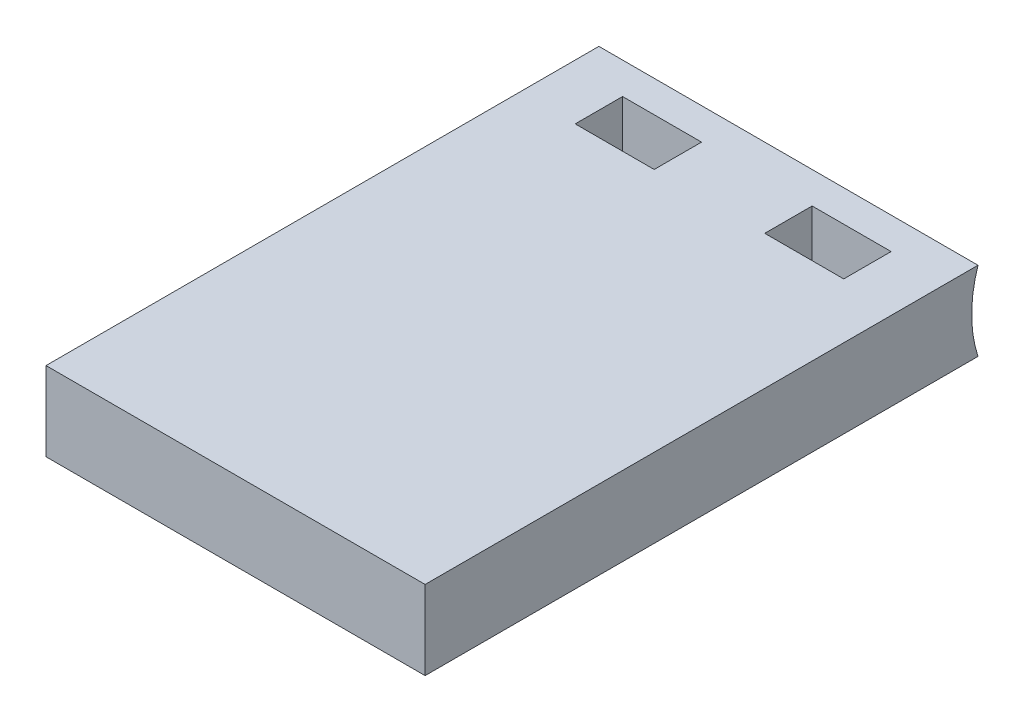
ISO-10303-21;
HEADER;
FILE_DESCRIPTION(('STEP AP214'),'2;1');
FILE_NAME('part.step','',(''),(''),'','','');
FILE_SCHEMA(('AUTOMOTIVE_DESIGN { 1 0 10303 214 1 1 1 1 }'));
ENDSEC;
DATA;
#1=APPLICATION_CONTEXT('core data for automotive mechanical design processes');
#2=APPLICATION_PROTOCOL_DEFINITION('international standard','automotive_design',2000,#1);
#3=PRODUCT_CONTEXT('',#1,'mechanical');
#4=PRODUCT('Part','Part','',(#3));
#5=PRODUCT_RELATED_PRODUCT_CATEGORY('part','',(#4));
#6=PRODUCT_DEFINITION_FORMATION('','',#4);
#7=PRODUCT_DEFINITION_CONTEXT('part definition',#1,'design');
#8=PRODUCT_DEFINITION('design','',#6,#7);
#9=PRODUCT_DEFINITION_SHAPE('','',#8);
#10=(LENGTH_UNIT() NAMED_UNIT(*) SI_UNIT(.MILLI.,.METRE.));
#11=(NAMED_UNIT(*) PLANE_ANGLE_UNIT() SI_UNIT($,.RADIAN.));
#12=(NAMED_UNIT(*) SI_UNIT($,.STERADIAN.) SOLID_ANGLE_UNIT());
#13=UNCERTAINTY_MEASURE_WITH_UNIT(LENGTH_MEASURE(1.E-05),#10,'distance_accuracy_value','');
#14=(GEOMETRIC_REPRESENTATION_CONTEXT(3) GLOBAL_UNCERTAINTY_ASSIGNED_CONTEXT((#13)) GLOBAL_UNIT_ASSIGNED_CONTEXT((#10,
#11,#12)) REPRESENTATION_CONTEXT('',''));
#15=CARTESIAN_POINT('',(0.,0.,0.));
#16=DIRECTION('',(0.,0.,1.));
#17=DIRECTION('',(1.,0.,0.));
#18=AXIS2_PLACEMENT_3D('',#15,#16,#17);
#19=CARTESIAN_POINT('',(-12.,5.,17.5));
#20=DIRECTION('',(1.,0.,0.));
#21=DIRECTION('',(0.,0.,-1.));
#22=AXIS2_PLACEMENT_3D('',#19,#20,#21);
#23=PLANE('',#22);
#24=DIRECTION('',(0.,0.,1.));
#25=VECTOR('',#24,1.);
#26=CARTESIAN_POINT('',(-12.,5.,17.5));
#27=LINE('',#26,#25);
#28=CARTESIAN_POINT('',(-12.,5.,-17.5));
#29=VERTEX_POINT('',#28);
#30=CARTESIAN_POINT('',(-12.,5.,17.5));
#31=VERTEX_POINT('',#30);
#32=EDGE_CURVE('E197',#29,#31,#27,.T.);
#33=ORIENTED_EDGE('',*,*,#32,.F.);
#34=CARTESIAN_POINT('',(-12.,2.5,-25.0993420767853));
#35=DIRECTION('',(-1.,0.,0.));
#36=DIRECTION('',(0.,0.,1.));
#37=AXIS2_PLACEMENT_3D('',#34,#35,#36);
#38=CIRCLE('',#37,8.);
#39=CARTESIAN_POINT('',(-12.,0.,-17.5));
#40=VERTEX_POINT('',#39);
#41=EDGE_CURVE('E159',#40,#29,#38,.T.);
#42=ORIENTED_EDGE('',*,*,#41,.F.);
#43=DIRECTION('',(0.,0.,1.));
#44=VECTOR('',#43,1.);
#45=CARTESIAN_POINT('',(-12.,0.,17.5));
#46=LINE('',#45,#44);
#47=CARTESIAN_POINT('',(-12.,0.,17.5));
#48=VERTEX_POINT('',#47);
#49=EDGE_CURVE('E195',#40,#48,#46,.T.);
#50=ORIENTED_EDGE('',*,*,#49,.T.);
#51=DIRECTION('',(0.,-1.,0.));
#52=VECTOR('',#51,1.);
#53=CARTESIAN_POINT('',(-12.,5.,17.5));
#54=LINE('',#53,#52);
#55=EDGE_CURVE('E11',#31,#48,#54,.T.);
#56=ORIENTED_EDGE('',*,*,#55,.F.);
#57=EDGE_LOOP('',(#33,#42,#50,#56));
#58=FACE_BOUND('',#57,.T.);
#59=ADVANCED_FACE('F34',(#58),#23,.F.);
#60=CARTESIAN_POINT('',(12.,5.,17.5));
#61=DIRECTION('',(0.,0.,-1.));
#62=DIRECTION('',(-1.,0.,0.));
#63=AXIS2_PLACEMENT_3D('',#60,#61,#62);
#64=PLANE('',#63);
#65=DIRECTION('',(1.,0.,0.));
#66=VECTOR('',#65,1.);
#67=CARTESIAN_POINT('',(12.,0.,17.5));
#68=LINE('',#67,#66);
#69=CARTESIAN_POINT('',(12.,0.,17.5));
#70=VERTEX_POINT('',#69);
#71=EDGE_CURVE('E211',#48,#70,#68,.T.);
#72=ORIENTED_EDGE('',*,*,#71,.T.);
#73=DIRECTION('',(0.,-1.,0.));
#74=VECTOR('',#73,1.);
#75=CARTESIAN_POINT('',(12.,5.,17.5));
#76=LINE('',#75,#74);
#77=CARTESIAN_POINT('',(12.,5.,17.5));
#78=VERTEX_POINT('',#77);
#79=EDGE_CURVE('E41',#78,#70,#76,.T.);
#80=ORIENTED_EDGE('',*,*,#79,.F.);
#81=DIRECTION('',(1.,0.,0.));
#82=VECTOR('',#81,1.);
#83=CARTESIAN_POINT('',(12.,5.,17.5));
#84=LINE('',#83,#82);
#85=EDGE_CURVE('E200',#31,#78,#84,.T.);
#86=ORIENTED_EDGE('',*,*,#85,.F.);
#87=ORIENTED_EDGE('',*,*,#55,.T.);
#88=EDGE_LOOP('',(#72,#80,#86,#87));
#89=FACE_BOUND('',#88,.T.);
#90=ADVANCED_FACE('F234',(#89),#64,.F.);
#91=CARTESIAN_POINT('',(12.,5.,17.5));
#92=DIRECTION('',(-1.,0.,0.));
#93=DIRECTION('',(0.,0.,1.));
#94=AXIS2_PLACEMENT_3D('',#91,#92,#93);
#95=PLANE('',#94);
#96=DIRECTION('',(0.,0.,-1.));
#97=VECTOR('',#96,1.);
#98=CARTESIAN_POINT('',(12.,0.,17.5));
#99=LINE('',#98,#97);
#100=CARTESIAN_POINT('',(12.,0.,-17.5));
#101=VERTEX_POINT('',#100);
#102=EDGE_CURVE('E213',#70,#101,#99,.T.);
#103=ORIENTED_EDGE('',*,*,#102,.T.);
#104=CARTESIAN_POINT('',(12.,2.5,-25.0993420767853));
#105=DIRECTION('',(-1.,0.,0.));
#106=DIRECTION('',(0.,0.,1.));
#107=AXIS2_PLACEMENT_3D('',#104,#105,#106);
#108=CIRCLE('',#107,8.);
#109=CARTESIAN_POINT('',(12.,5.,-17.5));
#110=VERTEX_POINT('',#109);
#111=EDGE_CURVE('E192',#101,#110,#108,.T.);
#112=ORIENTED_EDGE('',*,*,#111,.T.);
#113=DIRECTION('',(0.,0.,-1.));
#114=VECTOR('',#113,1.);
#115=CARTESIAN_POINT('',(12.,5.,17.5));
#116=LINE('',#115,#114);
#117=EDGE_CURVE('E203',#78,#110,#116,.T.);
#118=ORIENTED_EDGE('',*,*,#117,.F.);
#119=ORIENTED_EDGE('',*,*,#79,.T.);
#120=EDGE_LOOP('',(#103,#112,#118,#119));
#121=FACE_BOUND('',#120,.T.);
#122=ADVANCED_FACE('F221',(#121),#95,.F.);
#123=CARTESIAN_POINT('',(0.,5.,0.));
#124=DIRECTION('',(0.,1.,0.));
#125=DIRECTION('',(0.,0.,1.));
#126=AXIS2_PLACEMENT_3D('',#123,#124,#125);
#127=PLANE('',#126);
#128=DIRECTION('',(0.,0.,1.));
#129=VECTOR('',#128,1.);
#130=CARTESIAN_POINT('',(-8.5,5.,-12.5));
#131=LINE('',#130,#129);
#132=CARTESIAN_POINT('',(-8.5,5.,-15.5));
#133=VERTEX_POINT('',#132);
#134=CARTESIAN_POINT('',(-8.5,5.,-12.5));
#135=VERTEX_POINT('',#134);
#136=EDGE_CURVE('E48',#133,#135,#131,.T.);
#137=ORIENTED_EDGE('',*,*,#136,.F.);
#138=DIRECTION('',(-1.,0.,0.));
#139=VECTOR('',#138,1.);
#140=CARTESIAN_POINT('',(-3.5,5.,-15.5));
#141=LINE('',#140,#139);
#142=CARTESIAN_POINT('',(-3.5,5.,-15.5));
#143=VERTEX_POINT('',#142);
#144=EDGE_CURVE('E143',#143,#133,#141,.T.);
#145=ORIENTED_EDGE('',*,*,#144,.F.);
#146=DIRECTION('',(0.,0.,-1.));
#147=VECTOR('',#146,1.);
#148=CARTESIAN_POINT('',(-3.5,5.,-12.5));
#149=LINE('',#148,#147);
#150=CARTESIAN_POINT('',(-3.5,5.,-12.5));
#151=VERTEX_POINT('',#150);
#152=EDGE_CURVE('E146',#151,#143,#149,.T.);
#153=ORIENTED_EDGE('',*,*,#152,.F.);
#154=DIRECTION('',(1.,0.,0.));
#155=VECTOR('',#154,1.);
#156=CARTESIAN_POINT('',(-3.5,5.,-12.5));
#157=LINE('',#156,#155);
#158=EDGE_CURVE('E152',#135,#151,#157,.T.);
#159=ORIENTED_EDGE('',*,*,#158,.F.);
#160=EDGE_LOOP('',(#137,#145,#153,#159));
#161=FACE_BOUND('',#160,.T.);
#162=DIRECTION('',(0.,0.,1.));
#163=VECTOR('',#162,1.);
#164=CARTESIAN_POINT('',(3.5,5.,-12.5));
#165=LINE('',#164,#163);
#166=CARTESIAN_POINT('',(3.5,5.,-15.5));
#167=VERTEX_POINT('',#166);
#168=CARTESIAN_POINT('',(3.5,5.,-12.5));
#169=VERTEX_POINT('',#168);
#170=EDGE_CURVE('E56',#167,#169,#165,.T.);
#171=ORIENTED_EDGE('',*,*,#170,.F.);
#172=DIRECTION('',(-1.,0.,0.));
#173=VECTOR('',#172,1.);
#174=CARTESIAN_POINT('',(8.5,5.,-15.5));
#175=LINE('',#174,#173);
#176=CARTESIAN_POINT('',(8.5,5.,-15.5));
#177=VERTEX_POINT('',#176);
#178=EDGE_CURVE('E167',#177,#167,#175,.T.);
#179=ORIENTED_EDGE('',*,*,#178,.F.);
#180=DIRECTION('',(0.,0.,-1.));
#181=VECTOR('',#180,1.);
#182=CARTESIAN_POINT('',(8.5,5.,-12.5));
#183=LINE('',#182,#181);
#184=CARTESIAN_POINT('',(8.5,5.,-12.5));
#185=VERTEX_POINT('',#184);
#186=EDGE_CURVE('E181',#185,#177,#183,.T.);
#187=ORIENTED_EDGE('',*,*,#186,.F.);
#188=DIRECTION('',(1.,0.,0.));
#189=VECTOR('',#188,1.);
#190=CARTESIAN_POINT('',(8.5,5.,-12.5));
#191=LINE('',#190,#189);
#192=EDGE_CURVE('E178',#169,#185,#191,.T.);
#193=ORIENTED_EDGE('',*,*,#192,.F.);
#194=EDGE_LOOP('',(#171,#179,#187,#193));
#195=FACE_BOUND('',#194,.T.);
#196=ORIENTED_EDGE('',*,*,#32,.T.);
#197=ORIENTED_EDGE('',*,*,#85,.T.);
#198=ORIENTED_EDGE('',*,*,#117,.T.);
#199=DIRECTION('',(-1.,0.,0.));
#200=VECTOR('',#199,1.);
#201=CARTESIAN_POINT('',(12.,5.,-17.5));
#202=LINE('',#201,#200);
#203=EDGE_CURVE('E206',#110,#29,#202,.T.);
#204=ORIENTED_EDGE('',*,*,#203,.T.);
#205=EDGE_LOOP('',(#196,#197,#198,#204));
#206=FACE_BOUND('',#205,.T.);
#207=ADVANCED_FACE('F233',(#161,#195,#206),#127,.T.);
#208=CARTESIAN_POINT('',(0.,0.,0.));
#209=DIRECTION('',(0.,1.,0.));
#210=DIRECTION('',(0.,0.,1.));
#211=AXIS2_PLACEMENT_3D('',#208,#209,#210);
#212=PLANE('',#211);
#213=DIRECTION('',(-1.,0.,0.));
#214=VECTOR('',#213,1.);
#215=CARTESIAN_POINT('',(-3.5,0.,-15.5));
#216=LINE('',#215,#214);
#217=CARTESIAN_POINT('',(-3.5,0.,-15.5));
#218=VERTEX_POINT('',#217);
#219=CARTESIAN_POINT('',(-8.5,0.,-15.5));
#220=VERTEX_POINT('',#219);
#221=EDGE_CURVE('E130',#218,#220,#216,.T.);
#222=ORIENTED_EDGE('',*,*,#221,.T.);
#223=DIRECTION('',(0.,0.,1.));
#224=VECTOR('',#223,1.);
#225=CARTESIAN_POINT('',(-8.5,0.,-12.5));
#226=LINE('',#225,#224);
#227=CARTESIAN_POINT('',(-8.5,0.,-12.5));
#228=VERTEX_POINT('',#227);
#229=EDGE_CURVE('E124',#220,#228,#226,.T.);
#230=ORIENTED_EDGE('',*,*,#229,.T.);
#231=DIRECTION('',(1.,0.,0.));
#232=VECTOR('',#231,1.);
#233=CARTESIAN_POINT('',(-3.5,0.,-12.5));
#234=LINE('',#233,#232);
#235=CARTESIAN_POINT('',(-3.5,0.,-12.5));
#236=VERTEX_POINT('',#235);
#237=EDGE_CURVE('E134',#228,#236,#234,.T.);
#238=ORIENTED_EDGE('',*,*,#237,.T.);
#239=DIRECTION('',(0.,0.,-1.));
#240=VECTOR('',#239,1.);
#241=CARTESIAN_POINT('',(-3.5,0.,-12.5));
#242=LINE('',#241,#240);
#243=EDGE_CURVE('E138',#236,#218,#242,.T.);
#244=ORIENTED_EDGE('',*,*,#243,.T.);
#245=EDGE_LOOP('',(#222,#230,#238,#244));
#246=FACE_BOUND('',#245,.T.);
#247=DIRECTION('',(-1.,0.,0.));
#248=VECTOR('',#247,1.);
#249=CARTESIAN_POINT('',(8.5,0.,-15.5));
#250=LINE('',#249,#248);
#251=CARTESIAN_POINT('',(8.5,0.,-15.5));
#252=VERTEX_POINT('',#251);
#253=CARTESIAN_POINT('',(3.5,0.,-15.5));
#254=VERTEX_POINT('',#253);
#255=EDGE_CURVE('E173',#252,#254,#250,.T.);
#256=ORIENTED_EDGE('',*,*,#255,.T.);
#257=DIRECTION('',(0.,0.,1.));
#258=VECTOR('',#257,1.);
#259=CARTESIAN_POINT('',(3.5,0.,-12.5));
#260=LINE('',#259,#258);
#261=CARTESIAN_POINT('',(3.5,0.,-12.5));
#262=VERTEX_POINT('',#261);
#263=EDGE_CURVE('E163',#254,#262,#260,.T.);
#264=ORIENTED_EDGE('',*,*,#263,.T.);
#265=DIRECTION('',(1.,0.,0.));
#266=VECTOR('',#265,1.);
#267=CARTESIAN_POINT('',(8.5,0.,-12.5));
#268=LINE('',#267,#266);
#269=CARTESIAN_POINT('',(8.5,0.,-12.5));
#270=VERTEX_POINT('',#269);
#271=EDGE_CURVE('E166',#262,#270,#268,.T.);
#272=ORIENTED_EDGE('',*,*,#271,.T.);
#273=DIRECTION('',(0.,0.,-1.));
#274=VECTOR('',#273,1.);
#275=CARTESIAN_POINT('',(8.5,0.,-12.5));
#276=LINE('',#275,#274);
#277=EDGE_CURVE('E170',#270,#252,#276,.T.);
#278=ORIENTED_EDGE('',*,*,#277,.T.);
#279=EDGE_LOOP('',(#256,#264,#272,#278));
#280=FACE_BOUND('',#279,.T.);
#281=ORIENTED_EDGE('',*,*,#49,.F.);
#282=DIRECTION('',(-1.,0.,0.));
#283=VECTOR('',#282,1.);
#284=CARTESIAN_POINT('',(12.,0.,-17.5));
#285=LINE('',#284,#283);
#286=EDGE_CURVE('E201',#101,#40,#285,.T.);
#287=ORIENTED_EDGE('',*,*,#286,.F.);
#288=ORIENTED_EDGE('',*,*,#102,.F.);
#289=ORIENTED_EDGE('',*,*,#71,.F.);
#290=EDGE_LOOP('',(#281,#287,#288,#289));
#291=FACE_BOUND('',#290,.T.);
#292=ADVANCED_FACE('F140',(#246,#280,#291),#212,.F.);
#293=CARTESIAN_POINT('',(12.,2.5,-25.0993420767853));
#294=DIRECTION('',(-1.,0.,0.));
#295=DIRECTION('',(0.,0.,1.));
#296=AXIS2_PLACEMENT_3D('',#293,#294,#295);
#297=CYLINDRICAL_SURFACE('',#296,8.);
#298=ORIENTED_EDGE('',*,*,#203,.F.);
#299=ORIENTED_EDGE('',*,*,#111,.F.);
#300=ORIENTED_EDGE('',*,*,#286,.T.);
#301=ORIENTED_EDGE('',*,*,#41,.T.);
#302=EDGE_LOOP('',(#298,#299,#300,#301));
#303=FACE_BOUND('',#302,.T.);
#304=ADVANCED_FACE('F228',(#303),#297,.F.);
#305=CARTESIAN_POINT('',(3.5,0.,-12.5));
#306=DIRECTION('',(-1.,0.,0.));
#307=DIRECTION('',(0.,0.,1.));
#308=AXIS2_PLACEMENT_3D('',#305,#306,#307);
#309=PLANE('',#308);
#310=ORIENTED_EDGE('',*,*,#170,.T.);
#311=DIRECTION('',(0.,1.,0.));
#312=VECTOR('',#311,1.);
#313=CARTESIAN_POINT('',(3.5,0.,-12.5));
#314=LINE('',#313,#312);
#315=EDGE_CURVE('E176',#262,#169,#314,.T.);
#316=ORIENTED_EDGE('',*,*,#315,.F.);
#317=ORIENTED_EDGE('',*,*,#263,.F.);
#318=DIRECTION('',(0.,1.,0.));
#319=VECTOR('',#318,1.);
#320=CARTESIAN_POINT('',(3.5,0.,-15.5));
#321=LINE('',#320,#319);
#322=EDGE_CURVE('E153',#254,#167,#321,.T.);
#323=ORIENTED_EDGE('',*,*,#322,.T.);
#324=EDGE_LOOP('',(#310,#316,#317,#323));
#325=FACE_BOUND('',#324,.T.);
#326=ADVANCED_FACE('F249',(#325),#309,.F.);
#327=CARTESIAN_POINT('',(8.5,0.,-15.5));
#328=DIRECTION('',(0.,0.,-1.));
#329=DIRECTION('',(-1.,0.,0.));
#330=AXIS2_PLACEMENT_3D('',#327,#328,#329);
#331=PLANE('',#330);
#332=ORIENTED_EDGE('',*,*,#178,.T.);
#333=ORIENTED_EDGE('',*,*,#322,.F.);
#334=ORIENTED_EDGE('',*,*,#255,.F.);
#335=DIRECTION('',(0.,1.,0.));
#336=VECTOR('',#335,1.);
#337=CARTESIAN_POINT('',(8.5,0.,-15.5));
#338=LINE('',#337,#336);
#339=EDGE_CURVE('E187',#252,#177,#338,.T.);
#340=ORIENTED_EDGE('',*,*,#339,.T.);
#341=EDGE_LOOP('',(#332,#333,#334,#340));
#342=FACE_BOUND('',#341,.T.);
#343=ADVANCED_FACE('F252',(#342),#331,.F.);
#344=CARTESIAN_POINT('',(8.5,0.,-12.5));
#345=DIRECTION('',(1.,0.,0.));
#346=DIRECTION('',(0.,0.,-1.));
#347=AXIS2_PLACEMENT_3D('',#344,#345,#346);
#348=PLANE('',#347);
#349=ORIENTED_EDGE('',*,*,#186,.T.);
#350=ORIENTED_EDGE('',*,*,#339,.F.);
#351=ORIENTED_EDGE('',*,*,#277,.F.);
#352=DIRECTION('',(0.,1.,0.));
#353=VECTOR('',#352,1.);
#354=CARTESIAN_POINT('',(8.5,0.,-12.5));
#355=LINE('',#354,#353);
#356=EDGE_CURVE('E189',#270,#185,#355,.T.);
#357=ORIENTED_EDGE('',*,*,#356,.T.);
#358=EDGE_LOOP('',(#349,#350,#351,#357));
#359=FACE_BOUND('',#358,.T.);
#360=ADVANCED_FACE('F256',(#359),#348,.F.);
#361=CARTESIAN_POINT('',(8.5,0.,-12.5));
#362=DIRECTION('',(0.,0.,1.));
#363=DIRECTION('',(1.,0.,0.));
#364=AXIS2_PLACEMENT_3D('',#361,#362,#363);
#365=PLANE('',#364);
#366=ORIENTED_EDGE('',*,*,#192,.T.);
#367=ORIENTED_EDGE('',*,*,#356,.F.);
#368=ORIENTED_EDGE('',*,*,#271,.F.);
#369=ORIENTED_EDGE('',*,*,#315,.T.);
#370=EDGE_LOOP('',(#366,#367,#368,#369));
#371=FACE_BOUND('',#370,.T.);
#372=ADVANCED_FACE('F253',(#371),#365,.F.);
#373=CARTESIAN_POINT('',(-8.5,0.,-12.5));
#374=DIRECTION('',(-1.,0.,0.));
#375=DIRECTION('',(0.,0.,1.));
#376=AXIS2_PLACEMENT_3D('',#373,#374,#375);
#377=PLANE('',#376);
#378=ORIENTED_EDGE('',*,*,#136,.T.);
#379=DIRECTION('',(0.,1.,0.));
#380=VECTOR('',#379,1.);
#381=CARTESIAN_POINT('',(-8.5,0.,-12.5));
#382=LINE('',#381,#380);
#383=EDGE_CURVE('E120',#228,#135,#382,.T.);
#384=ORIENTED_EDGE('',*,*,#383,.F.);
#385=ORIENTED_EDGE('',*,*,#229,.F.);
#386=DIRECTION('',(0.,1.,0.));
#387=VECTOR('',#386,1.);
#388=CARTESIAN_POINT('',(-8.5,0.,-15.5));
#389=LINE('',#388,#387);
#390=EDGE_CURVE('E157',#220,#133,#389,.T.);
#391=ORIENTED_EDGE('',*,*,#390,.T.);
#392=EDGE_LOOP('',(#378,#384,#385,#391));
#393=FACE_BOUND('',#392,.T.);
#394=ADVANCED_FACE('F122',(#393),#377,.F.);
#395=CARTESIAN_POINT('',(-3.5,0.,-15.5));
#396=DIRECTION('',(0.,0.,-1.));
#397=DIRECTION('',(-1.,0.,0.));
#398=AXIS2_PLACEMENT_3D('',#395,#396,#397);
#399=PLANE('',#398);
#400=ORIENTED_EDGE('',*,*,#144,.T.);
#401=ORIENTED_EDGE('',*,*,#390,.F.);
#402=ORIENTED_EDGE('',*,*,#221,.F.);
#403=DIRECTION('',(0.,1.,0.));
#404=VECTOR('',#403,1.);
#405=CARTESIAN_POINT('',(-3.5,0.,-15.5));
#406=LINE('',#405,#404);
#407=EDGE_CURVE('E160',#218,#143,#406,.T.);
#408=ORIENTED_EDGE('',*,*,#407,.T.);
#409=EDGE_LOOP('',(#400,#401,#402,#408));
#410=FACE_BOUND('',#409,.T.);
#411=ADVANCED_FACE('F266',(#410),#399,.F.);
#412=CARTESIAN_POINT('',(-3.5,0.,-12.5));
#413=DIRECTION('',(1.,0.,0.));
#414=DIRECTION('',(0.,0.,-1.));
#415=AXIS2_PLACEMENT_3D('',#412,#413,#414);
#416=PLANE('',#415);
#417=ORIENTED_EDGE('',*,*,#152,.T.);
#418=ORIENTED_EDGE('',*,*,#407,.F.);
#419=ORIENTED_EDGE('',*,*,#243,.F.);
#420=DIRECTION('',(0.,1.,0.));
#421=VECTOR('',#420,1.);
#422=CARTESIAN_POINT('',(-3.5,0.,-12.5));
#423=LINE('',#422,#421);
#424=EDGE_CURVE('E129',#236,#151,#423,.T.);
#425=ORIENTED_EDGE('',*,*,#424,.T.);
#426=EDGE_LOOP('',(#417,#418,#419,#425));
#427=FACE_BOUND('',#426,.T.);
#428=ADVANCED_FACE('F269',(#427),#416,.F.);
#429=CARTESIAN_POINT('',(-3.5,0.,-12.5));
#430=DIRECTION('',(0.,0.,1.));
#431=DIRECTION('',(1.,0.,0.));
#432=AXIS2_PLACEMENT_3D('',#429,#430,#431);
#433=PLANE('',#432);
#434=ORIENTED_EDGE('',*,*,#158,.T.);
#435=ORIENTED_EDGE('',*,*,#424,.F.);
#436=ORIENTED_EDGE('',*,*,#237,.F.);
#437=ORIENTED_EDGE('',*,*,#383,.T.);
#438=EDGE_LOOP('',(#434,#435,#436,#437));
#439=FACE_BOUND('',#438,.T.);
#440=ADVANCED_FACE('F135',(#439),#433,.F.);
#441=CLOSED_SHELL('',(#59,#90,#122,#207,#292,#304,#326,#343,#360,#372,#394,#411,#428,#440));
#442=MANIFOLD_SOLID_BREP('B2',#441);
#443=ADVANCED_BREP_SHAPE_REPRESENTATION('',(#18,#442),#14);
#444=SHAPE_DEFINITION_REPRESENTATION(#9,#443);
ENDSEC;
END-ISO-10303-21;
